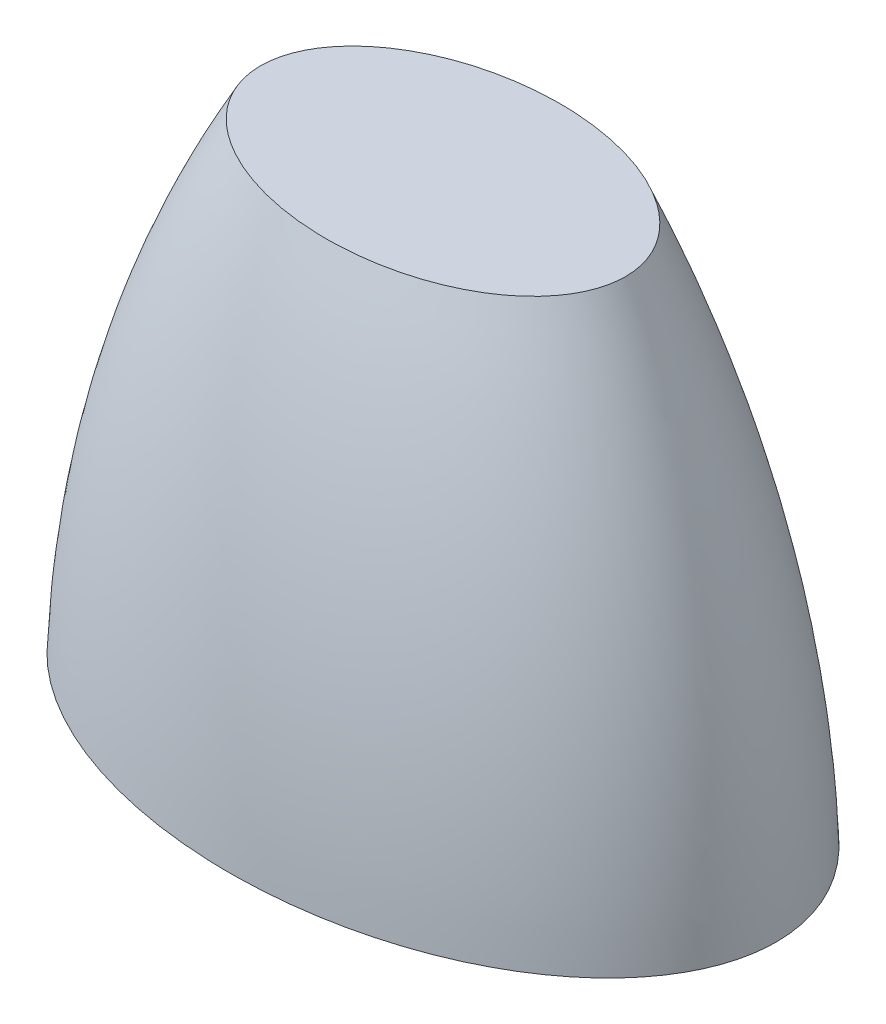
ISO-10303-21;
HEADER;
FILE_DESCRIPTION(('STEP AP214'),'2;1');
FILE_NAME('part.step','',(''),(''),'','','');
FILE_SCHEMA(('AUTOMOTIVE_DESIGN { 1 0 10303 214 1 1 1 1 }'));
ENDSEC;
DATA;
#1=APPLICATION_CONTEXT('core data for automotive mechanical design processes');
#2=APPLICATION_PROTOCOL_DEFINITION('international standard','automotive_design',2000,#1);
#3=PRODUCT_CONTEXT('',#1,'mechanical');
#4=PRODUCT('Part','Part','',(#3));
#5=PRODUCT_RELATED_PRODUCT_CATEGORY('part','',(#4));
#6=PRODUCT_DEFINITION_FORMATION('','',#4);
#7=PRODUCT_DEFINITION_CONTEXT('part definition',#1,'design');
#8=PRODUCT_DEFINITION('design','',#6,#7);
#9=PRODUCT_DEFINITION_SHAPE('','',#8);
#10=(LENGTH_UNIT() NAMED_UNIT(*) SI_UNIT(.MILLI.,.METRE.));
#11=(NAMED_UNIT(*) PLANE_ANGLE_UNIT() SI_UNIT($,.RADIAN.));
#12=(NAMED_UNIT(*) SI_UNIT($,.STERADIAN.) SOLID_ANGLE_UNIT());
#13=UNCERTAINTY_MEASURE_WITH_UNIT(LENGTH_MEASURE(1.E-05),#10,'distance_accuracy_value','');
#14=(GEOMETRIC_REPRESENTATION_CONTEXT(3) GLOBAL_UNCERTAINTY_ASSIGNED_CONTEXT((#13)) GLOBAL_UNIT_ASSIGNED_CONTEXT((#10,
#11,#12)) REPRESENTATION_CONTEXT('',''));
#15=CARTESIAN_POINT('',(0.,0.,0.));
#16=DIRECTION('',(0.,0.,1.));
#17=DIRECTION('',(1.,0.,0.));
#18=AXIS2_PLACEMENT_3D('',#15,#16,#17);
#19=CARTESIAN_POINT('',(0.,-152.620267453145,0.));
#20=DIRECTION('',(0.,1.,0.));
#21=DIRECTION('',(2.07418258699991E-10,0.,1.));
#22=AXIS2_PLACEMENT_3D('',#19,#20,#21);
#23=PLANE('',#22);
#24=CARTESIAN_POINT('',(0.,-152.620267453145,0.));
#25=DIRECTION('',(0.,1.,0.));
#26=DIRECTION('',(1.,0.,-2.07418258699991E-10));
#27=AXIS2_PLACEMENT_3D('',#24,#25,#26);
#28=ELLIPSE('',#27,101.629530532166,65.1316057088801);
#29=CARTESIAN_POINT('',(101.629530532166,-152.620267453145,-2.10798202554796E-08));
#30=VERTEX_POINT('',#29);
#31=EDGE_CURVE('E88',#30,#30,#28,.T.);
#32=ORIENTED_EDGE('',*,*,#31,.F.);
#33=EDGE_LOOP('',(#32));
#34=FACE_BOUND('',#33,.T.);
#35=ADVANCED_FACE('F80',(#34),#23,.F.);
#36=CARTESIAN_POINT('',(0.,0.,0.));
#37=DIRECTION('',(0.,1.,0.));
#38=DIRECTION('',(0.,0.,1.));
#39=AXIS2_PLACEMENT_3D('',#36,#37,#38);
#40=PLANE('',#39);
#41=CARTESIAN_POINT('',(0.,0.,0.));
#42=DIRECTION('',(0.,1.,0.));
#43=DIRECTION('',(1.,0.,0.));
#44=AXIS2_PLACEMENT_3D('',#41,#42,#43);
#45=ELLIPSE('',#44,55.6357904839907,35.6554669703826);
#46=CARTESIAN_POINT('',(55.6357904839907,0.,0.));
#47=VERTEX_POINT('',#46);
#48=EDGE_CURVE('E13',#47,#47,#45,.T.);
#49=ORIENTED_EDGE('',*,*,#48,.T.);
#50=EDGE_LOOP('',(#49));
#51=FACE_BOUND('',#50,.T.);
#52=ADVANCED_FACE('F130',(#51),#40,.T.);
#53=CARTESIAN_POINT('',(0.,0.,-35.6554669703826));
#54=CARTESIAN_POINT('',(0.,-4.69481377622822,-37.3387453692182));
#55=CARTESIAN_POINT('',(2.22044604925031E-13,-14.0361285584179,-40.6879801076015));
#56=CARTESIAN_POINT('',(-5.759281940243E-13,-30.8170909891476,-45.9721916818705));
#57=CARTESIAN_POINT('',(2.64892274781658E-12,-52.5035464721758,-51.9257608327629));
#58=CARTESIAN_POINT('',(-1.07188563580607E-11,-77.182787321901,-57.2469226085358));
#59=CARTESIAN_POINT('',(3.26162707953159E-11,-103.890356105279,-61.4994422602661));
#60=CARTESIAN_POINT('',(-1.14788387128861E-10,-124.656290246409,-63.6594208618724));
#61=CARTESIAN_POINT('',(1.51760548572355E-10,-141.509213420267,-64.7424338796209));
#62=CARTESIAN_POINT('',(-8.95753436702673E-09,-148.918054357002,-65.0019333088837));
#63=CARTESIAN_POINT('',(-1.35094661152246E-08,-152.620267453145,-65.1316057088801));
#64=CARTESIAN_POINT('',(14.755111468296,0.,-35.6554669703826));
#65=CARTESIAN_POINT('',(15.4516935780642,-4.69481377622822,-37.3387453692182));
#66=CARTESIAN_POINT('',(16.8376895023188,-14.0361285584179,-40.6879801076015));
#67=CARTESIAN_POINT('',(19.0244265562781,-30.8170909891476,-45.9721916818706));
#68=CARTESIAN_POINT('',(21.4881602812838,-52.5035464721758,-51.9257608327619));
#69=CARTESIAN_POINT('',(23.690188239776,-77.182787321901,-57.2469226085402));
#70=CARTESIAN_POINT('',(25.4499857355166,-103.890356105279,-61.4994422602525));
#71=CARTESIAN_POINT('',(26.3438381440986,-124.656290246409,-63.65942086192));
#72=CARTESIAN_POINT('',(26.7920156373638,-141.509213420267,-64.7424338795581));
#73=CARTESIAN_POINT('',(26.8994028911367,-148.918054357002,-65.0019333125906));
#74=CARTESIAN_POINT('',(26.9530645233234,-152.620267453145,-65.1316057144707));
#75=CARTESIAN_POINT('',(28.9070053515082,0.,-31.898730389733));
#76=CARTESIAN_POINT('',(30.2716919428701,-4.69481377622822,-33.4046549611297));
#77=CARTESIAN_POINT('',(32.9870215888493,-14.0361285584179,-36.4010071340057));
#78=CARTESIAN_POINT('',(37.2710976432378,-30.8170909891476,-41.1284628274044));
#79=CARTESIAN_POINT('',(42.0978428783654,-52.5035464721758,-46.4547511455078));
#80=CARTESIAN_POINT('',(46.4118756199878,-77.182787321901,-51.2152638878287));
#81=CARTESIAN_POINT('',(49.8595266753913,-103.890356105279,-55.0197289354752));
#82=CARTESIAN_POINT('',(51.6106890719727,-124.656290246409,-56.9521275525437));
#83=CARTESIAN_POINT('',(52.4887216927293,-141.509213420267,-57.9210319924356));
#84=CARTESIAN_POINT('',(52.6991060106817,-148.918054357002,-58.1531900118648));
#85=CARTESIAN_POINT('',(52.8042354882609,-152.620267453145,-58.2691998529782));
#86=CARTESIAN_POINT('',(49.7738841042993,0.,-18.5257145725279));
#87=CARTESIAN_POINT('',(52.1236865626015,-4.69481377622822,-19.4003051420143));
#88=CARTESIAN_POINT('',(56.799110442055,-14.0361285584179,-21.1404861597308));
#89=CARTESIAN_POINT('',(64.1756996954985,-30.8170909891476,-23.8860341411133));
#90=CARTESIAN_POINT('',(72.4866905785986,-52.5035464721758,-26.9793640607217));
#91=CARTESIAN_POINT('',(79.9148611238699,-77.182787321901,-29.744110469309));
#92=CARTESIAN_POINT('',(85.8512416647027,-103.890356105279,-31.9536163873021));
#93=CARTESIAN_POINT('',(88.8665022605237,-124.656290246409,-33.0758888033864));
#94=CARTESIAN_POINT('',(90.3783535701299,-141.509213420267,-33.6385960608327));
#95=CARTESIAN_POINT('',(90.7406064150929,-148.918054357002,-33.7734256737966));
#96=CARTESIAN_POINT('',(90.9216249088341,-152.620267453145,-33.8408003094683));
#97=CARTESIAN_POINT('',(55.6357904839907,0.,-9.45615016926075));
#98=CARTESIAN_POINT('',(58.2623308796512,-4.69481377622822,-9.90257072320502));
#99=CARTESIAN_POINT('',(63.4883828155628,-14.0361285584179,-10.790817865349));
#100=CARTESIAN_POINT('',(71.7337183278784,-30.8170909891476,-12.1922382482028));
#101=CARTESIAN_POINT('',(81.0235006265139,-52.5035464721758,-13.7711782738801));
#102=CARTESIAN_POINT('',(89.3264921967576,-77.182787321901,-15.182398182153));
#103=CARTESIAN_POINT('',(95.9620045732932,-103.890356105279,-16.3102045983608));
#104=CARTESIAN_POINT('',(99.3323745933326,-124.656290246409,-16.8830503289848));
#105=CARTESIAN_POINT('',(101.022277726545,-141.509213420267,-17.1702751106646));
#106=CARTESIAN_POINT('',(101.427193354295,-148.918054357002,-17.2390967048619));
#107=CARTESIAN_POINT('',(101.629530528584,-152.620267453145,-17.2734869974205));
#108=CARTESIAN_POINT('',(55.6357904839907,0.,9.45615016926068));
#109=CARTESIAN_POINT('',(58.2623308796512,-4.69481377622822,9.90257072320511));
#110=CARTESIAN_POINT('',(63.4883828155627,-14.0361285584179,10.7908178653494));
#111=CARTESIAN_POINT('',(71.7337183278787,-30.8170909891476,12.1922382482014));
#112=CARTESIAN_POINT('',(81.0235006265125,-52.5035464721758,13.771178273888));
#113=CARTESIAN_POINT('',(89.3264921967632,-77.182787321901,15.1823981821197));
#114=CARTESIAN_POINT('',(95.9620045732759,-103.890356105279,16.3102045984629));
#115=CARTESIAN_POINT('',(99.3323745933935,-124.656290246409,16.8830503286263));
#116=CARTESIAN_POINT('',(101.022277726465,-141.509213420267,17.1702751111383));
#117=CARTESIAN_POINT('',(101.427193359047,-148.918054357002,17.2390966769077));
#118=CARTESIAN_POINT('',(101.629530535749,-152.620267453145,17.2734869552609));
#119=CARTESIAN_POINT('',(49.7738841042993,0.,18.5257145725279));
#120=CARTESIAN_POINT('',(52.1236865626015,-4.69481377622822,19.4003051420144));
#121=CARTESIAN_POINT('',(56.7991104420548,-14.0361285584179,21.1404861597312));
#122=CARTESIAN_POINT('',(64.1756996954991,-30.8170909891476,23.886034141112));
#123=CARTESIAN_POINT('',(72.4866905785958,-52.5035464721758,26.9793640607288));
#124=CARTESIAN_POINT('',(79.914861123881,-77.182787321901,29.7441104692792));
#125=CARTESIAN_POINT('',(85.8512416646688,-103.890356105279,31.9536163873934));
#126=CARTESIAN_POINT('',(88.866502260643,-124.656290246409,33.0758888030657));
#127=CARTESIAN_POINT('',(90.3783535699723,-141.509213420267,33.6385960612566));
#128=CARTESIAN_POINT('',(90.7406064244011,-148.918054357002,33.7734256487878));
#129=CARTESIAN_POINT('',(90.9216249228726,-152.620267453145,33.8408002717507));
#130=CARTESIAN_POINT('',(28.9070053515083,0.,31.898730389733));
#131=CARTESIAN_POINT('',(30.27169194287,-4.69481377622822,33.4046549611297));
#132=CARTESIAN_POINT('',(32.9870215888488,-14.0361285584179,36.4010071340059));
#133=CARTESIAN_POINT('',(37.2710976432389,-30.8170909891476,41.1284628274037));
#134=CARTESIAN_POINT('',(42.0978428783604,-52.5035464721758,46.4547511455118));
#135=CARTESIAN_POINT('',(46.411875620007,-77.182787321901,51.2152638878114));
#136=CARTESIAN_POINT('',(49.859526675333,-103.890356105279,55.0197289355283));
#137=CARTESIAN_POINT('',(51.610689072178,-124.656290246409,56.9521275523574));
#138=CARTESIAN_POINT('',(52.4887216924578,-141.509213420267,57.9210319926817));
#139=CARTESIAN_POINT('',(52.6991060267092,-148.918054357002,58.1531899973404));
#140=CARTESIAN_POINT('',(52.8042355124331,-152.620267453145,58.269199831073));
#141=CARTESIAN_POINT('',(14.7551114682961,0.,35.6554669703826));
#142=CARTESIAN_POINT('',(15.4516935780641,-4.69481377622822,37.3387453692182));
#143=CARTESIAN_POINT('',(16.8376895023183,-14.0361285584179,40.6879801076016));
#144=CARTESIAN_POINT('',(19.0244265562793,-30.8170909891476,45.9721916818703));
#145=CARTESIAN_POINT('',(21.4881602812783,-52.5035464721758,51.925760832764));
#146=CARTESIAN_POINT('',(23.6901882397973,-77.182787321901,57.2469226085314));
#147=CARTESIAN_POINT('',(25.4499857354515,-103.890356105279,61.4994422602797));
#148=CARTESIAN_POINT('',(26.343838144328,-124.656290246409,63.6594208618248));
#149=CARTESIAN_POINT('',(26.7920156370604,-141.509213420267,64.7424338796837));
#150=CARTESIAN_POINT('',(26.8994029090518,-148.918054357002,65.0019333051768));
#151=CARTESIAN_POINT('',(26.9530645503423,-152.620267453145,65.1316057032896));
#152=CARTESIAN_POINT('',(-14.755111468296,0.,35.6554669703826));
#153=CARTESIAN_POINT('',(-15.4516935780641,-4.69481377622822,37.3387453692182));
#154=CARTESIAN_POINT('',(-16.8376895023186,-14.0361285584179,40.6879801076015));
#155=CARTESIAN_POINT('',(-19.0244265562784,-30.8170909891476,45.9721916818706));
#156=CARTESIAN_POINT('',(-21.4881602812835,-52.5035464721758,51.9257608327619));
#157=CARTESIAN_POINT('',(-23.690188239776,-77.182787321901,57.2469226085402));
#158=CARTESIAN_POINT('',(-25.449985735517,-103.890356105279,61.4994422602526));
#159=CARTESIAN_POINT('',(-26.3438381440983,-124.656290246409,63.6594208619199));
#160=CARTESIAN_POINT('',(-26.792015637364,-141.509213420267,64.7424338795581));
#161=CARTESIAN_POINT('',(-26.8994028911367,-148.918054357002,65.0019333125905));
#162=CARTESIAN_POINT('',(-26.9530645233233,-152.620267453145,65.1316057144707));
#163=CARTESIAN_POINT('',(-28.9070053515083,0.,31.8987303897331));
#164=CARTESIAN_POINT('',(-30.27169194287,-4.69481377622822,33.4046549611297));
#165=CARTESIAN_POINT('',(-32.987021588849,-14.0361285584179,36.4010071340057));
#166=CARTESIAN_POINT('',(-37.2710976432381,-30.8170909891476,41.1284628274044));
#167=CARTESIAN_POINT('',(-42.097842878365,-52.5035464721758,46.4547511455078));
#168=CARTESIAN_POINT('',(-46.4118756199879,-77.182787321901,51.2152638878287));
#169=CARTESIAN_POINT('',(-49.8595266753916,-103.890356105279,55.0197289354752));
#170=CARTESIAN_POINT('',(-51.6106890719725,-124.656290246409,56.9521275525437));
#171=CARTESIAN_POINT('',(-52.4887216927294,-141.509213420267,57.9210319924355));
#172=CARTESIAN_POINT('',(-52.6991060106817,-148.918054357002,58.1531900118647));
#173=CARTESIAN_POINT('',(-52.8042354882609,-152.620267453145,58.2691998529782));
#174=CARTESIAN_POINT('',(-49.7738841042993,0.,18.5257145725279));
#175=CARTESIAN_POINT('',(-52.1236865626015,-4.69481377622822,19.4003051420143));
#176=CARTESIAN_POINT('',(-56.7991104420548,-14.0361285584179,21.1404861597309));
#177=CARTESIAN_POINT('',(-64.1756996954987,-30.8170909891476,23.8860341411132));
#178=CARTESIAN_POINT('',(-72.4866905785983,-52.5035464721758,26.9793640607218));
#179=CARTESIAN_POINT('',(-79.91486112387,-77.182787321901,29.744110469309));
#180=CARTESIAN_POINT('',(-85.8512416647028,-103.890356105279,31.953616387302));
#181=CARTESIAN_POINT('',(-88.8665022605236,-124.656290246409,33.0758888033866));
#182=CARTESIAN_POINT('',(-90.37835357013,-141.509213420267,33.6385960608326));
#183=CARTESIAN_POINT('',(-90.7406064150929,-148.918054357002,33.7734256737966));
#184=CARTESIAN_POINT('',(-90.9216249088341,-152.620267453145,33.8408003094684));
#185=CARTESIAN_POINT('',(-55.6357904839907,0.,9.45615016926072));
#186=CARTESIAN_POINT('',(-58.2623308796512,-4.69481377622822,9.90257072320503));
#187=CARTESIAN_POINT('',(-63.4883828155627,-14.0361285584179,10.7908178653491));
#188=CARTESIAN_POINT('',(-71.7337183278786,-30.8170909891476,12.1922382482027));
#189=CARTESIAN_POINT('',(-81.0235006265137,-52.5035464721758,13.7711782738802));
#190=CARTESIAN_POINT('',(-89.3264921967576,-77.182787321901,15.182398182153));
#191=CARTESIAN_POINT('',(-95.9620045732933,-103.890356105279,16.3102045983607));
#192=CARTESIAN_POINT('',(-99.3323745933325,-124.656290246409,16.8830503289849));
#193=CARTESIAN_POINT('',(-101.022277726545,-141.509213420267,17.1702751106645));
#194=CARTESIAN_POINT('',(-101.427193354295,-148.918054357002,17.2390967048619));
#195=CARTESIAN_POINT('',(-101.629530528584,-152.620267453145,17.2734869974205));
#196=CARTESIAN_POINT('',(-55.6357904839907,0.,-9.45615016926071));
#197=CARTESIAN_POINT('',(-58.2623308796512,-4.69481377622822,-9.90257072320511));
#198=CARTESIAN_POINT('',(-63.4883828155627,-14.0361285584179,-10.7908178653493));
#199=CARTESIAN_POINT('',(-71.7337183278787,-30.8170909891476,-12.1922382482015));
#200=CARTESIAN_POINT('',(-81.0235006265125,-52.5035464721758,-13.7711782738879));
#201=CARTESIAN_POINT('',(-89.3264921967632,-77.182787321901,-15.1823981821197));
#202=CARTESIAN_POINT('',(-95.962004573276,-103.890356105279,-16.310204598463));
#203=CARTESIAN_POINT('',(-99.3323745933935,-124.656290246409,-16.8830503286262));
#204=CARTESIAN_POINT('',(-101.022277726465,-141.509213420267,-17.1702751111384));
#205=CARTESIAN_POINT('',(-101.427193359047,-148.918054357002,-17.2390966769078));
#206=CARTESIAN_POINT('',(-101.629530535749,-152.620267453145,-17.2734869552609));
#207=CARTESIAN_POINT('',(-49.7738841042993,0.,-18.5257145725279));
#208=CARTESIAN_POINT('',(-52.1236865626015,-4.69481377622822,-19.4003051420144));
#209=CARTESIAN_POINT('',(-56.7991104420547,-14.0361285584179,-21.1404861597311));
#210=CARTESIAN_POINT('',(-64.1756996954991,-30.8170909891476,-23.8860341411122));
#211=CARTESIAN_POINT('',(-72.4866905785958,-52.5035464721758,-26.9793640607287));
#212=CARTESIAN_POINT('',(-79.914861123881,-77.182787321901,-29.7441104692793));
#213=CARTESIAN_POINT('',(-85.8512416646688,-103.890356105279,-31.9536163873934));
#214=CARTESIAN_POINT('',(-88.866502260643,-124.656290246409,-33.0758888030657));
#215=CARTESIAN_POINT('',(-90.3783535699722,-141.509213420267,-33.6385960612566));
#216=CARTESIAN_POINT('',(-90.7406064244011,-148.918054357002,-33.7734256487878));
#217=CARTESIAN_POINT('',(-90.9216249228725,-152.620267453145,-33.8408002717508));
#218=CARTESIAN_POINT('',(-28.9070053515083,0.,-31.8987303897331));
#219=CARTESIAN_POINT('',(-30.27169194287,-4.69481377622822,-33.4046549611297));
#220=CARTESIAN_POINT('',(-32.9870215888488,-14.0361285584179,-36.4010071340058));
#221=CARTESIAN_POINT('',(-37.2710976432388,-30.8170909891476,-41.1284628274038));
#222=CARTESIAN_POINT('',(-42.0978428783605,-52.5035464721758,-46.4547511455117));
#223=CARTESIAN_POINT('',(-46.411875620007,-77.182787321901,-51.2152638878114));
#224=CARTESIAN_POINT('',(-49.859526675333,-103.890356105279,-55.0197289355283));
#225=CARTESIAN_POINT('',(-51.6106890721781,-124.656290246409,-56.9521275523574));
#226=CARTESIAN_POINT('',(-52.4887216924577,-141.509213420267,-57.9210319926817));
#227=CARTESIAN_POINT('',(-52.6991060267092,-148.918054357002,-58.1531899973405));
#228=CARTESIAN_POINT('',(-52.8042355124331,-152.620267453145,-58.2691998310731));
#229=CARTESIAN_POINT('',(-14.755111468296,0.,-35.6554669703826));
#230=CARTESIAN_POINT('',(-15.4516935780641,-4.69481377622822,-37.3387453692182));
#231=CARTESIAN_POINT('',(-16.8376895023184,-14.0361285584179,-40.6879801076015));
#232=CARTESIAN_POINT('',(-19.0244265562792,-30.8170909891476,-45.9721916818703));
#233=CARTESIAN_POINT('',(-21.4881602812785,-52.5035464721758,-51.9257608327639));
#234=CARTESIAN_POINT('',(-23.6901882397974,-77.182787321901,-57.2469226085314));
#235=CARTESIAN_POINT('',(-25.4499857354514,-103.890356105279,-61.4994422602797));
#236=CARTESIAN_POINT('',(-26.3438381443282,-124.656290246409,-63.6594208618249));
#237=CARTESIAN_POINT('',(-26.7920156370603,-141.509213420267,-64.7424338796838));
#238=CARTESIAN_POINT('',(-26.8994029090518,-148.918054357002,-65.0019333051769));
#239=CARTESIAN_POINT('',(-26.9530645503423,-152.620267453145,-65.1316057032896));
#240=CARTESIAN_POINT('',(0.,0.,-35.6554669703826));
#241=CARTESIAN_POINT('',(0.,-4.69481377622822,-37.3387453692182));
#242=CARTESIAN_POINT('',(2.22044604925031E-13,-14.0361285584179,-40.6879801076015));
#243=CARTESIAN_POINT('',(-5.759281940243E-13,-30.8170909891476,-45.9721916818705));
#244=CARTESIAN_POINT('',(2.64892274781658E-12,-52.5035464721758,-51.9257608327629));
#245=CARTESIAN_POINT('',(-1.07188563580607E-11,-77.182787321901,-57.2469226085358));
#246=CARTESIAN_POINT('',(3.26162707953159E-11,-103.890356105279,-61.4994422602661));
#247=CARTESIAN_POINT('',(-1.14788387128861E-10,-124.656290246409,-63.6594208618724));
#248=CARTESIAN_POINT('',(1.51760548572355E-10,-141.509213420267,-64.7424338796209));
#249=CARTESIAN_POINT('',(-8.95753436702673E-09,-148.918054357002,-65.0019333088837));
#250=CARTESIAN_POINT('',(-1.35094661152246E-08,-152.620267453145,-65.1316057088801));
#251=B_SPLINE_SURFACE_WITH_KNOTS('',3,3,((#53,#54,#55,#56,#57,#58,#59,#60,#61,#62,#63),(#64,#65,
#66,#67,#68,#69,#70,#71,#72,#73,#74),(#75,#76,#77,#78,#79,#80,#81,#82,#83,#84,#85),(#86,#87,#88,
#89,#90,#91,#92,#93,#94,#95,#96),(#97,#98,#99,#100,#101,#102,#103,#104,#105,#106,#107),(#108,
#109,#110,#111,#112,#113,#114,#115,#116,#117,#118),(#119,#120,#121,#122,#123,#124,#125,#126,
#127,#128,#129),(#130,#131,#132,#133,#134,#135,#136,#137,#138,#139,#140),(#141,#142,#143,#144,
#145,#146,#147,#148,#149,#150,#151),(#152,#153,#154,#155,#156,#157,#158,#159,#160,#161,#162),
(#163,#164,#165,#166,#167,#168,#169,#170,#171,#172,#173),(#174,#175,#176,#177,#178,#179,#180,
#181,#182,#183,#184),(#185,#186,#187,#188,#189,#190,#191,#192,#193,#194,#195),(#196,#197,#198,
#199,#200,#201,#202,#203,#204,#205,#206),(#207,#208,#209,#210,#211,#212,#213,#214,#215,#216,
#217),(#218,#219,#220,#221,#222,#223,#224,#225,#226,#227,#228),(#229,#230,#231,#232,#233,#234,
#235,#236,#237,#238,#239),(#240,#241,#242,#243,#244,#245,#246,#247,#248,#249,#250)),
.UNSPECIFIED.,.T.,.F.,.F.,(4,2,2,2,2,2,2,2,4),(4,1,1,1,1,1,1,1,4),(0.,0.125,0.25,0.375,0.5,
0.625,0.75,0.875,1.),(0.,0.0958359630942692,0.190685710102245,0.338013795986929,
0.527860936342954,0.675501909736464,0.857544183736706,0.92881453481116,1.),.UNSPECIFIED.);
#252=ORIENTED_EDGE('',*,*,#48,.F.);
#253=EDGE_LOOP('',(#252));
#254=FACE_BOUND('',#253,.T.);
#255=ORIENTED_EDGE('',*,*,#31,.T.);
#256=EDGE_LOOP('',(#255));
#257=FACE_BOUND('',#256,.T.);
#258=ADVANCED_FACE('F113',(#254,#257),#251,.T.);
#259=CLOSED_SHELL('',(#35,#52,#258));
#260=MANIFOLD_SOLID_BREP('B2',#259);
#261=ADVANCED_BREP_SHAPE_REPRESENTATION('',(#18,#260),#14);
#262=SHAPE_DEFINITION_REPRESENTATION(#9,#261);
ENDSEC;
END-ISO-10303-21;
